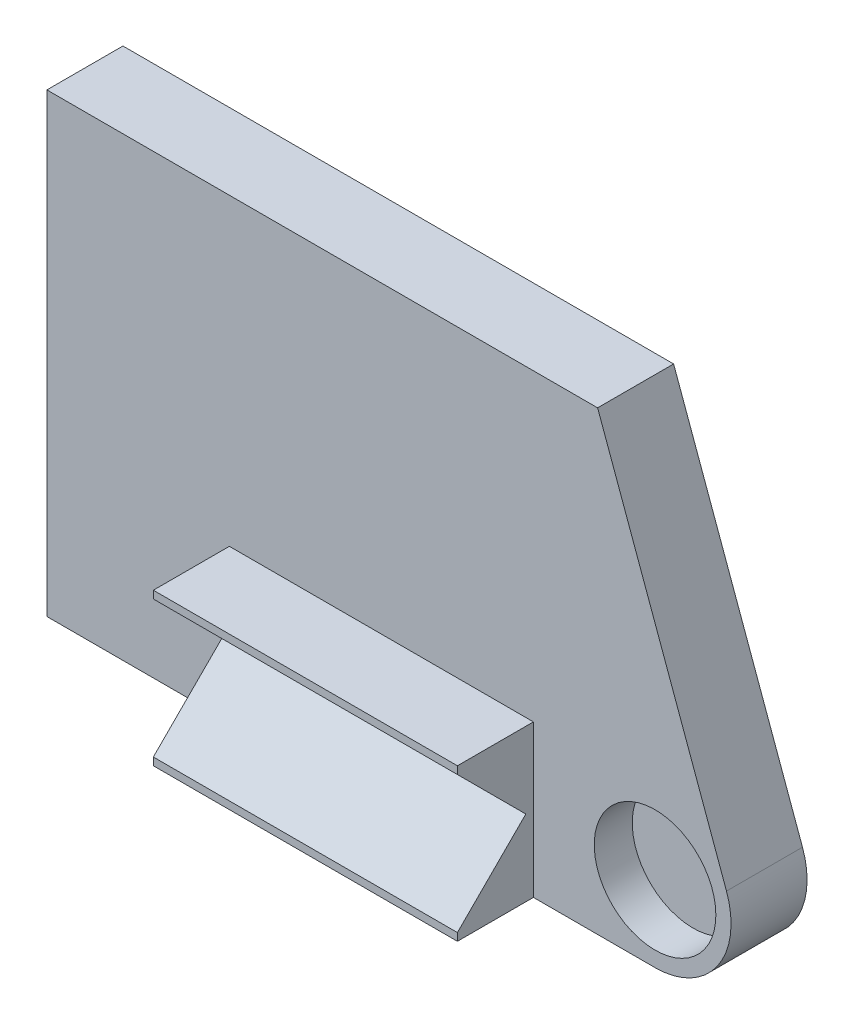
ISO-10303-21;
HEADER;
FILE_DESCRIPTION(('STEP AP214'),'2;1');
FILE_NAME('part.step','',(''),(''),'','','');
FILE_SCHEMA(('AUTOMOTIVE_DESIGN { 1 0 10303 214 1 1 1 1 }'));
ENDSEC;
DATA;
#1=APPLICATION_CONTEXT('core data for automotive mechanical design processes');
#2=APPLICATION_PROTOCOL_DEFINITION('international standard','automotive_design',2000,#1);
#3=PRODUCT_CONTEXT('',#1,'mechanical');
#4=PRODUCT('Part','Part','',(#3));
#5=PRODUCT_RELATED_PRODUCT_CATEGORY('part','',(#4));
#6=PRODUCT_DEFINITION_FORMATION('','',#4);
#7=PRODUCT_DEFINITION_CONTEXT('part definition',#1,'design');
#8=PRODUCT_DEFINITION('design','',#6,#7);
#9=PRODUCT_DEFINITION_SHAPE('','',#8);
#10=(LENGTH_UNIT() NAMED_UNIT(*) SI_UNIT(.MILLI.,.METRE.));
#11=(NAMED_UNIT(*) PLANE_ANGLE_UNIT() SI_UNIT($,.RADIAN.));
#12=(NAMED_UNIT(*) SI_UNIT($,.STERADIAN.) SOLID_ANGLE_UNIT());
#13=UNCERTAINTY_MEASURE_WITH_UNIT(LENGTH_MEASURE(1.E-05),#10,'distance_accuracy_value','');
#14=(GEOMETRIC_REPRESENTATION_CONTEXT(3) GLOBAL_UNCERTAINTY_ASSIGNED_CONTEXT((#13)) GLOBAL_UNIT_ASSIGNED_CONTEXT((#10,
#11,#12)) REPRESENTATION_CONTEXT('',''));
#15=CARTESIAN_POINT('',(0.,0.,0.));
#16=DIRECTION('',(0.,0.,1.));
#17=DIRECTION('',(1.,0.,0.));
#18=AXIS2_PLACEMENT_3D('',#15,#16,#17);
#19=CARTESIAN_POINT('',(-40.,0.,5.));
#20=DIRECTION('',(-1.,0.,0.));
#21=DIRECTION('',(0.,0.,1.));
#22=AXIS2_PLACEMENT_3D('',#19,#20,#21);
#23=PLANE('',#22);
#24=DIRECTION('',(0.,0.,-1.));
#25=VECTOR('',#24,1.);
#26=CARTESIAN_POINT('',(-40.,-5.00000000000001,5.));
#27=LINE('',#26,#25);
#28=CARTESIAN_POINT('',(-40.,-5.00000000000001,5.));
#29=VERTEX_POINT('',#28);
#30=CARTESIAN_POINT('',(-40.,-5.00000000000001,0.));
#31=VERTEX_POINT('',#30);
#32=EDGE_CURVE('E201',#29,#31,#27,.T.);
#33=ORIENTED_EDGE('',*,*,#32,.F.);
#34=DIRECTION('',(0.,1.,0.));
#35=VECTOR('',#34,1.);
#36=CARTESIAN_POINT('',(-40.,0.,5.));
#37=LINE('',#36,#35);
#38=CARTESIAN_POINT('',(-40.,25.,5.));
#39=VERTEX_POINT('',#38);
#40=EDGE_CURVE('E184',#29,#39,#37,.T.);
#41=ORIENTED_EDGE('',*,*,#40,.T.);
#42=DIRECTION('',(0.,0.,-1.));
#43=VECTOR('',#42,1.);
#44=CARTESIAN_POINT('',(-40.,25.,5.));
#45=LINE('',#44,#43);
#46=CARTESIAN_POINT('',(-40.,25.,0.));
#47=VERTEX_POINT('',#46);
#48=EDGE_CURVE('E203',#39,#47,#45,.T.);
#49=ORIENTED_EDGE('',*,*,#48,.T.);
#50=DIRECTION('',(0.,1.,0.));
#51=VECTOR('',#50,1.);
#52=CARTESIAN_POINT('',(-40.,0.,0.));
#53=LINE('',#52,#51);
#54=EDGE_CURVE('E195',#31,#47,#53,.T.);
#55=ORIENTED_EDGE('',*,*,#54,.F.);
#56=EDGE_LOOP('',(#33,#41,#49,#55));
#57=FACE_BOUND('',#56,.T.);
#58=ADVANCED_FACE('F37',(#57),#23,.T.);
#59=CARTESIAN_POINT('',(0.,0.,10.));
#60=DIRECTION('',(0.,0.,-1.));
#61=DIRECTION('',(-1.,0.,0.));
#62=AXIS2_PLACEMENT_3D('',#59,#60,#61);
#63=PLANE('',#62);
#64=DIRECTION('',(-1.,0.,0.));
#65=VECTOR('',#64,1.);
#66=CARTESIAN_POINT('',(-40.,4.99999999999999,10.));
#67=LINE('',#66,#65);
#68=CARTESIAN_POINT('',(-8.,4.99999999999999,10.));
#69=VERTEX_POINT('',#68);
#70=CARTESIAN_POINT('',(-28.,5.,10.));
#71=VERTEX_POINT('',#70);
#72=EDGE_CURVE('E166',#69,#71,#67,.T.);
#73=ORIENTED_EDGE('',*,*,#72,.T.);
#74=DIRECTION('',(0.,1.,0.));
#75=VECTOR('',#74,1.);
#76=CARTESIAN_POINT('',(-28.,-5.00000000000001,10.));
#77=LINE('',#76,#75);
#78=CARTESIAN_POINT('',(-28.,4.5,10.));
#79=VERTEX_POINT('',#78);
#80=EDGE_CURVE('E137',#79,#71,#77,.T.);
#81=ORIENTED_EDGE('',*,*,#80,.F.);
#82=DIRECTION('',(1.,0.,0.));
#83=VECTOR('',#82,1.);
#84=CARTESIAN_POINT('',(-28.,4.5,10.));
#85=LINE('',#84,#83);
#86=CARTESIAN_POINT('',(-8.,4.5,10.));
#87=VERTEX_POINT('',#86);
#88=EDGE_CURVE('E160',#79,#87,#85,.T.);
#89=ORIENTED_EDGE('',*,*,#88,.T.);
#90=DIRECTION('',(0.,1.,0.));
#91=VECTOR('',#90,1.);
#92=CARTESIAN_POINT('',(-8.,-5.00000000000001,10.));
#93=LINE('',#92,#91);
#94=EDGE_CURVE('E158',#87,#69,#93,.T.);
#95=ORIENTED_EDGE('',*,*,#94,.T.);
#96=EDGE_LOOP('',(#73,#81,#89,#95));
#97=FACE_BOUND('',#96,.T.);
#98=ADVANCED_FACE('F241',(#97),#63,.F.);
#99=CARTESIAN_POINT('',(0.,0.,5.));
#100=DIRECTION('',(0.,0.,-1.));
#101=DIRECTION('',(-1.,0.,0.));
#102=AXIS2_PLACEMENT_3D('',#99,#100,#101);
#103=CYLINDRICAL_SURFACE('',#102,5.);
#104=CARTESIAN_POINT('',(0.,0.,0.));
#105=DIRECTION('',(0.,0.,1.));
#106=DIRECTION('',(1.,0.,0.));
#107=AXIS2_PLACEMENT_3D('',#104,#105,#106);
#108=CIRCLE('',#107,5.);
#109=CARTESIAN_POINT('',(0.,-5.,0.));
#110=VERTEX_POINT('',#109);
#111=CARTESIAN_POINT('',(4.69846310392954,1.71010071662836,0.));
#112=VERTEX_POINT('',#111);
#113=EDGE_CURVE('E173',#110,#112,#108,.T.);
#114=ORIENTED_EDGE('',*,*,#113,.T.);
#115=DIRECTION('',(0.,0.,-1.));
#116=VECTOR('',#115,1.);
#117=CARTESIAN_POINT('',(4.69846310392954,1.71010071662836,5.));
#118=LINE('',#117,#116);
#119=CARTESIAN_POINT('',(4.69846310392954,1.71010071662836,5.));
#120=VERTEX_POINT('',#119);
#121=EDGE_CURVE('E11',#120,#112,#118,.T.);
#122=ORIENTED_EDGE('',*,*,#121,.F.);
#123=CARTESIAN_POINT('',(0.,0.,5.));
#124=DIRECTION('',(0.,0.,1.));
#125=DIRECTION('',(1.,0.,0.));
#126=AXIS2_PLACEMENT_3D('',#123,#124,#125);
#127=CIRCLE('',#126,5.);
#128=CARTESIAN_POINT('',(0.,-5.,5.));
#129=VERTEX_POINT('',#128);
#130=EDGE_CURVE('E86',#129,#120,#127,.T.);
#131=ORIENTED_EDGE('',*,*,#130,.F.);
#132=DIRECTION('',(0.,0.,-1.));
#133=VECTOR('',#132,1.);
#134=CARTESIAN_POINT('',(0.,-5.,5.));
#135=LINE('',#134,#133);
#136=EDGE_CURVE('E60',#129,#110,#135,.T.);
#137=ORIENTED_EDGE('',*,*,#136,.T.);
#138=EDGE_LOOP('',(#114,#122,#131,#137));
#139=FACE_BOUND('',#138,.T.);
#140=ADVANCED_FACE('F39',(#139),#103,.T.);
#141=CARTESIAN_POINT('',(4.69846310392954,1.71010071662836,5.));
#142=DIRECTION('',(0.939692620785907,0.342020143325673,0.));
#143=DIRECTION('',(-0.342020143325673,0.939692620785907,0.));
#144=AXIS2_PLACEMENT_3D('',#141,#142,#143);
#145=PLANE('',#144);
#146=DIRECTION('',(0.342020143325673,-0.939692620785907,0.));
#147=VECTOR('',#146,1.);
#148=CARTESIAN_POINT('',(4.69846310392954,1.71010071662836,0.));
#149=LINE('',#148,#147);
#150=CARTESIAN_POINT('',(-3.7783669942756,25.,0.));
#151=VERTEX_POINT('',#150);
#152=EDGE_CURVE('E189',#151,#112,#149,.T.);
#153=ORIENTED_EDGE('',*,*,#152,.F.);
#154=DIRECTION('',(0.,0.,-1.));
#155=VECTOR('',#154,1.);
#156=CARTESIAN_POINT('',(-3.7783669942756,25.,5.));
#157=LINE('',#156,#155);
#158=CARTESIAN_POINT('',(-3.7783669942756,25.,5.));
#159=VERTEX_POINT('',#158);
#160=EDGE_CURVE('E45',#159,#151,#157,.T.);
#161=ORIENTED_EDGE('',*,*,#160,.F.);
#162=DIRECTION('',(0.342020143325673,-0.939692620785907,0.));
#163=VECTOR('',#162,1.);
#164=CARTESIAN_POINT('',(4.69846310392954,1.71010071662836,5.));
#165=LINE('',#164,#163);
#166=EDGE_CURVE('E177',#159,#120,#165,.T.);
#167=ORIENTED_EDGE('',*,*,#166,.T.);
#168=ORIENTED_EDGE('',*,*,#121,.T.);
#169=EDGE_LOOP('',(#153,#161,#167,#168));
#170=FACE_BOUND('',#169,.T.);
#171=ADVANCED_FACE('F211',(#170),#145,.T.);
#172=CARTESIAN_POINT('',(0.,25.,5.));
#173=DIRECTION('',(0.,1.,0.));
#174=DIRECTION('',(-1.,0.,0.));
#175=AXIS2_PLACEMENT_3D('',#172,#173,#174);
#176=PLANE('',#175);
#177=DIRECTION('',(1.,0.,0.));
#178=VECTOR('',#177,1.);
#179=CARTESIAN_POINT('',(0.,25.,0.));
#180=LINE('',#179,#178);
#181=EDGE_CURVE('E192',#47,#151,#180,.T.);
#182=ORIENTED_EDGE('',*,*,#181,.F.);
#183=ORIENTED_EDGE('',*,*,#48,.F.);
#184=DIRECTION('',(1.,0.,0.));
#185=VECTOR('',#184,1.);
#186=CARTESIAN_POINT('',(0.,25.,5.));
#187=LINE('',#186,#185);
#188=EDGE_CURVE('E181',#39,#159,#187,.T.);
#189=ORIENTED_EDGE('',*,*,#188,.T.);
#190=ORIENTED_EDGE('',*,*,#160,.T.);
#191=EDGE_LOOP('',(#182,#183,#189,#190));
#192=FACE_BOUND('',#191,.T.);
#193=ADVANCED_FACE('F207',(#192),#176,.T.);
#194=CARTESIAN_POINT('',(0.,-5.,5.));
#195=DIRECTION('',(0.,-1.,0.));
#196=DIRECTION('',(1.,0.,0.));
#197=AXIS2_PLACEMENT_3D('',#194,#195,#196);
#198=PLANE('',#197);
#199=DIRECTION('',(0.,0.,1.));
#200=VECTOR('',#199,1.);
#201=CARTESIAN_POINT('',(-28.,-5.00000000000001,5.));
#202=LINE('',#201,#200);
#203=CARTESIAN_POINT('',(-28.,-5.00000000000001,5.));
#204=VERTEX_POINT('',#203);
#205=CARTESIAN_POINT('',(-28.,-5.00000000000001,10.));
#206=VERTEX_POINT('',#205);
#207=EDGE_CURVE('E142',#204,#206,#202,.T.);
#208=ORIENTED_EDGE('',*,*,#207,.F.);
#209=DIRECTION('',(1.,0.,0.));
#210=VECTOR('',#209,1.);
#211=CARTESIAN_POINT('',(-28.,-5.00000000000001,5.));
#212=LINE('',#211,#210);
#213=EDGE_CURVE('E143',#29,#204,#212,.T.);
#214=ORIENTED_EDGE('',*,*,#213,.F.);
#215=ORIENTED_EDGE('',*,*,#32,.T.);
#216=DIRECTION('',(-1.,0.,0.));
#217=VECTOR('',#216,1.);
#218=CARTESIAN_POINT('',(0.,-5.,0.));
#219=LINE('',#218,#217);
#220=EDGE_CURVE('E178',#110,#31,#219,.T.);
#221=ORIENTED_EDGE('',*,*,#220,.F.);
#222=ORIENTED_EDGE('',*,*,#136,.F.);
#223=DIRECTION('',(-1.,0.,0.));
#224=VECTOR('',#223,1.);
#225=CARTESIAN_POINT('',(0.,-5.,5.));
#226=LINE('',#225,#224);
#227=CARTESIAN_POINT('',(-8.,-5.,5.));
#228=VERTEX_POINT('',#227);
#229=EDGE_CURVE('E186',#129,#228,#226,.T.);
#230=ORIENTED_EDGE('',*,*,#229,.T.);
#231=DIRECTION('',(0.,0.,-1.));
#232=VECTOR('',#231,1.);
#233=CARTESIAN_POINT('',(-8.,-5.00000000000001,10.));
#234=LINE('',#233,#232);
#235=CARTESIAN_POINT('',(-8.,-5.00000000000001,10.));
#236=VERTEX_POINT('',#235);
#237=EDGE_CURVE('E165',#236,#228,#234,.T.);
#238=ORIENTED_EDGE('',*,*,#237,.F.);
#239=DIRECTION('',(1.,0.,0.));
#240=VECTOR('',#239,1.);
#241=CARTESIAN_POINT('',(-40.,-5.00000000000001,10.));
#242=LINE('',#241,#240);
#243=EDGE_CURVE('E156',#206,#236,#242,.T.);
#244=ORIENTED_EDGE('',*,*,#243,.F.);
#245=EDGE_LOOP('',(#208,#214,#215,#221,#222,#230,#238,#244));
#246=FACE_BOUND('',#245,.T.);
#247=ADVANCED_FACE('F217',(#246),#198,.T.);
#248=CARTESIAN_POINT('',(0.,0.,5.));
#249=DIRECTION('',(0.,0.,1.));
#250=DIRECTION('',(1.,0.,0.));
#251=AXIS2_PLACEMENT_3D('',#248,#249,#250);
#252=PLANE('',#251);
#253=DIRECTION('',(-1.,0.,0.));
#254=VECTOR('',#253,1.);
#255=CARTESIAN_POINT('',(-40.,4.99999999999999,5.));
#256=LINE('',#255,#254);
#257=CARTESIAN_POINT('',(-8.,4.99999999999999,5.));
#258=VERTEX_POINT('',#257);
#259=CARTESIAN_POINT('',(-28.,5.,5.));
#260=VERTEX_POINT('',#259);
#261=EDGE_CURVE('E147',#258,#260,#256,.T.);
#262=ORIENTED_EDGE('',*,*,#261,.F.);
#263=DIRECTION('',(0.,1.,0.));
#264=VECTOR('',#263,1.);
#265=CARTESIAN_POINT('',(-8.,-5.00000000000001,5.));
#266=LINE('',#265,#264);
#267=EDGE_CURVE('E52',#228,#258,#266,.T.);
#268=ORIENTED_EDGE('',*,*,#267,.F.);
#269=ORIENTED_EDGE('',*,*,#229,.F.);
#270=ORIENTED_EDGE('',*,*,#130,.T.);
#271=ORIENTED_EDGE('',*,*,#166,.F.);
#272=ORIENTED_EDGE('',*,*,#188,.F.);
#273=ORIENTED_EDGE('',*,*,#40,.F.);
#274=ORIENTED_EDGE('',*,*,#213,.T.);
#275=DIRECTION('',(0.,1.,0.));
#276=VECTOR('',#275,1.);
#277=CARTESIAN_POINT('',(-28.,-5.00000000000001,5.));
#278=LINE('',#277,#276);
#279=EDGE_CURVE('E134',#204,#260,#278,.T.);
#280=ORIENTED_EDGE('',*,*,#279,.T.);
#281=EDGE_LOOP('',(#262,#268,#269,#270,#271,#272,#273,#274,#280));
#282=FACE_BOUND('',#281,.T.);
#283=CARTESIAN_POINT('',(0.,0.,5.));
#284=DIRECTION('',(0.,0.,1.));
#285=DIRECTION('',(1.,0.,0.));
#286=AXIS2_PLACEMENT_3D('',#283,#284,#285);
#287=CIRCLE('',#286,4.);
#288=CARTESIAN_POINT('',(4.,0.,5.));
#289=VERTEX_POINT('',#288);
#290=EDGE_CURVE('E169',#289,#289,#287,.T.);
#291=ORIENTED_EDGE('',*,*,#290,.F.);
#292=EDGE_LOOP('',(#291));
#293=FACE_BOUND('',#292,.T.);
#294=ADVANCED_FACE('F145',(#282,#293),#252,.T.);
#295=CARTESIAN_POINT('',(0.,0.,0.));
#296=DIRECTION('',(0.,0.,1.));
#297=DIRECTION('',(1.,0.,0.));
#298=AXIS2_PLACEMENT_3D('',#295,#296,#297);
#299=PLANE('',#298);
#300=ORIENTED_EDGE('',*,*,#113,.F.);
#301=ORIENTED_EDGE('',*,*,#220,.T.);
#302=ORIENTED_EDGE('',*,*,#54,.T.);
#303=ORIENTED_EDGE('',*,*,#181,.T.);
#304=ORIENTED_EDGE('',*,*,#152,.T.);
#305=EDGE_LOOP('',(#300,#301,#302,#303,#304));
#306=FACE_BOUND('',#305,.T.);
#307=ADVANCED_FACE('F213',(#306),#299,.F.);
#308=CARTESIAN_POINT('',(0.,0.,2.5));
#309=DIRECTION('',(0.,0.,1.));
#310=DIRECTION('',(1.,0.,0.));
#311=AXIS2_PLACEMENT_3D('',#308,#309,#310);
#312=CYLINDRICAL_SURFACE('',#311,4.);
#313=CARTESIAN_POINT('',(0.,0.,2.5));
#314=DIRECTION('',(0.,0.,1.));
#315=DIRECTION('',(1.,0.,0.));
#316=AXIS2_PLACEMENT_3D('',#313,#314,#315);
#317=CIRCLE('',#316,4.);
#318=CARTESIAN_POINT('',(4.,0.,2.5));
#319=VERTEX_POINT('',#318);
#320=EDGE_CURVE('E170',#319,#319,#317,.T.);
#321=ORIENTED_EDGE('',*,*,#320,.F.);
#322=EDGE_LOOP('',(#321));
#323=FACE_BOUND('',#322,.T.);
#324=ORIENTED_EDGE('',*,*,#290,.T.);
#325=EDGE_LOOP('',(#324));
#326=FACE_BOUND('',#325,.T.);
#327=ADVANCED_FACE('F357',(#323,#326),#312,.F.);
#328=CARTESIAN_POINT('',(0.,0.,2.5));
#329=DIRECTION('',(0.,0.,1.));
#330=DIRECTION('',(1.,0.,0.));
#331=AXIS2_PLACEMENT_3D('',#328,#329,#330);
#332=PLANE('',#331);
#333=ORIENTED_EDGE('',*,*,#320,.T.);
#334=EDGE_LOOP('',(#333));
#335=FACE_BOUND('',#334,.T.);
#336=ADVANCED_FACE('F351',(#335),#332,.T.);
#337=CARTESIAN_POINT('',(-8.,-5.00000000000001,10.));
#338=DIRECTION('',(-1.,0.,0.));
#339=DIRECTION('',(0.,0.,1.));
#340=AXIS2_PLACEMENT_3D('',#337,#338,#339);
#341=PLANE('',#340);
#342=ORIENTED_EDGE('',*,*,#94,.F.);
#343=DIRECTION('',(0.,0.707106781186548,0.707106781186547));
#344=VECTOR('',#343,1.);
#345=CARTESIAN_POINT('',(-8.,4.5,10.));
#346=LINE('',#345,#344);
#347=CARTESIAN_POINT('',(-8.,0.,5.5));
#348=VERTEX_POINT('',#347);
#349=EDGE_CURVE('E227',#348,#87,#346,.T.);
#350=ORIENTED_EDGE('',*,*,#349,.F.);
#351=DIRECTION('',(0.,0.707106781186548,-0.707106781186547));
#352=VECTOR('',#351,1.);
#353=CARTESIAN_POINT('',(-8.,0.,5.5));
#354=LINE('',#353,#352);
#355=CARTESIAN_POINT('',(-8.,-4.5,10.));
#356=VERTEX_POINT('',#355);
#357=EDGE_CURVE('E222',#356,#348,#354,.T.);
#358=ORIENTED_EDGE('',*,*,#357,.F.);
#359=EDGE_CURVE('E238',#236,#356,#93,.T.);
#360=ORIENTED_EDGE('',*,*,#359,.F.);
#361=ORIENTED_EDGE('',*,*,#237,.T.);
#362=ORIENTED_EDGE('',*,*,#267,.T.);
#363=DIRECTION('',(0.,0.,-1.));
#364=VECTOR('',#363,1.);
#365=CARTESIAN_POINT('',(-8.,4.99999999999999,10.));
#366=LINE('',#365,#364);
#367=EDGE_CURVE('E155',#69,#258,#366,.T.);
#368=ORIENTED_EDGE('',*,*,#367,.F.);
#369=EDGE_LOOP('',(#342,#350,#358,#360,#361,#362,#368));
#370=FACE_BOUND('',#369,.T.);
#371=ADVANCED_FACE('F246',(#370),#341,.F.);
#372=CARTESIAN_POINT('',(-40.,4.99999999999999,10.));
#373=DIRECTION('',(0.,-1.,0.));
#374=DIRECTION('',(0.,0.,-1.));
#375=AXIS2_PLACEMENT_3D('',#372,#373,#374);
#376=PLANE('',#375);
#377=ORIENTED_EDGE('',*,*,#261,.T.);
#378=DIRECTION('',(0.,0.,1.));
#379=VECTOR('',#378,1.);
#380=CARTESIAN_POINT('',(-28.,5.,5.));
#381=LINE('',#380,#379);
#382=EDGE_CURVE('E131',#260,#71,#381,.T.);
#383=ORIENTED_EDGE('',*,*,#382,.T.);
#384=ORIENTED_EDGE('',*,*,#72,.F.);
#385=ORIENTED_EDGE('',*,*,#367,.T.);
#386=EDGE_LOOP('',(#377,#383,#384,#385));
#387=FACE_BOUND('',#386,.T.);
#388=ADVANCED_FACE('F153',(#387),#376,.F.);
#389=DIRECTION('',(1.,0.,0.));
#390=VECTOR('',#389,1.);
#391=CARTESIAN_POINT('',(-28.,-4.5,10.));
#392=LINE('',#391,#390);
#393=CARTESIAN_POINT('',(-28.,-4.5,10.));
#394=VERTEX_POINT('',#393);
#395=EDGE_CURVE('E229',#394,#356,#392,.T.);
#396=ORIENTED_EDGE('',*,*,#395,.F.);
#397=EDGE_CURVE('E150',#206,#394,#77,.T.);
#398=ORIENTED_EDGE('',*,*,#397,.F.);
#399=ORIENTED_EDGE('',*,*,#243,.T.);
#400=ORIENTED_EDGE('',*,*,#359,.T.);
#401=EDGE_LOOP('',(#396,#398,#399,#400));
#402=FACE_BOUND('',#401,.T.);
#403=ADVANCED_FACE('F253',(#402),#63,.F.);
#404=CARTESIAN_POINT('',(-28.,4.5,10.));
#405=DIRECTION('',(0.,0.707106781186547,-0.707106781186548));
#406=DIRECTION('',(0.,0.707106781186548,0.707106781186547));
#407=AXIS2_PLACEMENT_3D('',#404,#405,#406);
#408=PLANE('',#407);
#409=ORIENTED_EDGE('',*,*,#349,.T.);
#410=ORIENTED_EDGE('',*,*,#88,.F.);
#411=DIRECTION('',(0.,0.707106781186548,0.707106781186547));
#412=VECTOR('',#411,1.);
#413=CARTESIAN_POINT('',(-28.,4.5,10.));
#414=LINE('',#413,#412);
#415=CARTESIAN_POINT('',(-28.,0.,5.5));
#416=VERTEX_POINT('',#415);
#417=EDGE_CURVE('E226',#416,#79,#414,.T.);
#418=ORIENTED_EDGE('',*,*,#417,.F.);
#419=DIRECTION('',(1.,0.,0.));
#420=VECTOR('',#419,1.);
#421=CARTESIAN_POINT('',(-28.,0.,5.5));
#422=LINE('',#421,#420);
#423=EDGE_CURVE('E235',#416,#348,#422,.T.);
#424=ORIENTED_EDGE('',*,*,#423,.T.);
#425=EDGE_LOOP('',(#409,#410,#418,#424));
#426=FACE_BOUND('',#425,.T.);
#427=ADVANCED_FACE('F260',(#426),#408,.F.);
#428=CARTESIAN_POINT('',(-28.,0.,5.5));
#429=DIRECTION('',(0.,-0.707106781186547,-0.707106781186548));
#430=DIRECTION('',(0.,0.707106781186548,-0.707106781186547));
#431=AXIS2_PLACEMENT_3D('',#428,#429,#430);
#432=PLANE('',#431);
#433=ORIENTED_EDGE('',*,*,#357,.T.);
#434=ORIENTED_EDGE('',*,*,#423,.F.);
#435=DIRECTION('',(0.,0.707106781186548,-0.707106781186547));
#436=VECTOR('',#435,1.);
#437=CARTESIAN_POINT('',(-28.,0.,5.5));
#438=LINE('',#437,#436);
#439=EDGE_CURVE('E224',#394,#416,#438,.T.);
#440=ORIENTED_EDGE('',*,*,#439,.F.);
#441=ORIENTED_EDGE('',*,*,#395,.T.);
#442=EDGE_LOOP('',(#433,#434,#440,#441));
#443=FACE_BOUND('',#442,.T.);
#444=ADVANCED_FACE('F257',(#443),#432,.F.);
#445=CARTESIAN_POINT('',(-28.,-5.00000000000001,5.));
#446=DIRECTION('',(1.,0.,0.));
#447=DIRECTION('',(0.,0.,-1.));
#448=AXIS2_PLACEMENT_3D('',#445,#446,#447);
#449=PLANE('',#448);
#450=ORIENTED_EDGE('',*,*,#80,.T.);
#451=ORIENTED_EDGE('',*,*,#382,.F.);
#452=ORIENTED_EDGE('',*,*,#279,.F.);
#453=ORIENTED_EDGE('',*,*,#207,.T.);
#454=ORIENTED_EDGE('',*,*,#397,.T.);
#455=ORIENTED_EDGE('',*,*,#439,.T.);
#456=ORIENTED_EDGE('',*,*,#417,.T.);
#457=EDGE_LOOP('',(#450,#451,#452,#453,#454,#455,#456));
#458=FACE_BOUND('',#457,.T.);
#459=ADVANCED_FACE('F133',(#458),#449,.F.);
#460=CLOSED_SHELL('',(#58,#98,#140,#171,#193,#247,#294,#307,#327,#336,#371,#388,#403,#427,#444,#459));
#461=MANIFOLD_SOLID_BREP('B2',#460);
#462=ADVANCED_BREP_SHAPE_REPRESENTATION('',(#18,#461),#14);
#463=SHAPE_DEFINITION_REPRESENTATION(#9,#462);
ENDSEC;
END-ISO-10303-21;
